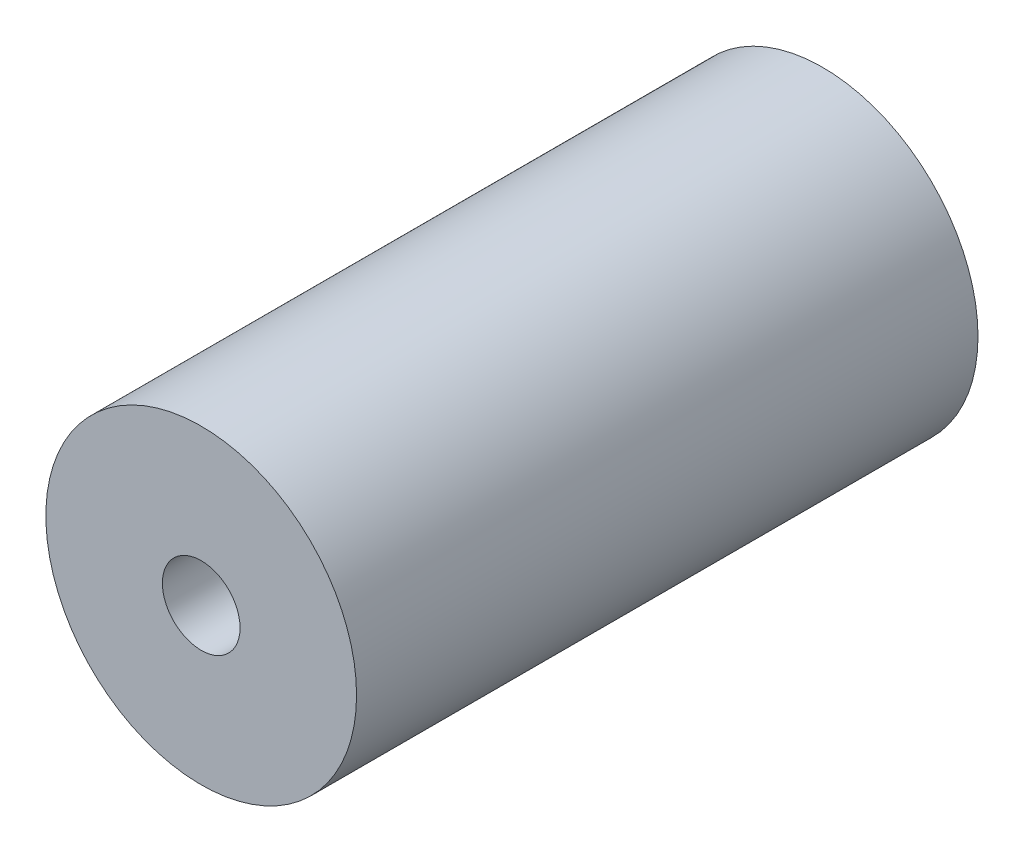
ISO-10303-21;
HEADER;
FILE_DESCRIPTION(('STEP AP214'),'2;1');
FILE_NAME('part.step','',(''),(''),'','','');
FILE_SCHEMA(('AUTOMOTIVE_DESIGN { 1 0 10303 214 1 1 1 1 }'));
ENDSEC;
DATA;
#1=APPLICATION_CONTEXT('core data for automotive mechanical design processes');
#2=APPLICATION_PROTOCOL_DEFINITION('international standard','automotive_design',2000,#1);
#3=PRODUCT_CONTEXT('',#1,'mechanical');
#4=PRODUCT('Part','Part','',(#3));
#5=PRODUCT_RELATED_PRODUCT_CATEGORY('part','',(#4));
#6=PRODUCT_DEFINITION_FORMATION('','',#4);
#7=PRODUCT_DEFINITION_CONTEXT('part definition',#1,'design');
#8=PRODUCT_DEFINITION('design','',#6,#7);
#9=PRODUCT_DEFINITION_SHAPE('','',#8);
#10=(LENGTH_UNIT() NAMED_UNIT(*) SI_UNIT(.MILLI.,.METRE.));
#11=(NAMED_UNIT(*) PLANE_ANGLE_UNIT() SI_UNIT($,.RADIAN.));
#12=(NAMED_UNIT(*) SI_UNIT($,.STERADIAN.) SOLID_ANGLE_UNIT());
#13=UNCERTAINTY_MEASURE_WITH_UNIT(LENGTH_MEASURE(1.E-05),#10,'distance_accuracy_value','');
#14=(GEOMETRIC_REPRESENTATION_CONTEXT(3) GLOBAL_UNCERTAINTY_ASSIGNED_CONTEXT((#13)) GLOBAL_UNIT_ASSIGNED_CONTEXT((#10,
#11,#12)) REPRESENTATION_CONTEXT('',''));
#15=CARTESIAN_POINT('',(0.,0.,0.));
#16=DIRECTION('',(0.,0.,1.));
#17=DIRECTION('',(1.,0.,0.));
#18=AXIS2_PLACEMENT_3D('',#15,#16,#17);
#19=CARTESIAN_POINT('',(0.,0.,10.));
#20=DIRECTION('',(0.,0.,1.));
#21=DIRECTION('',(1.,0.,0.));
#22=AXIS2_PLACEMENT_3D('',#19,#20,#21);
#23=PLANE('',#22);
#24=DIRECTION('',(0.999999969980788,-0.000245027392792052,0.));
#25=VECTOR('',#24,1.);
#26=CARTESIAN_POINT('',(-1.07243011245673,-0.899940916891799,10.));
#27=LINE('',#26,#25);
#28=CARTESIAN_POINT('',(-0.867476774897159,-0.899991136075253,10.));
#29=VERTEX_POINT('',#28);
#30=CARTESIAN_POINT('',(-0.831301535960417,-0.900000004416444,10.));
#31=VERTEX_POINT('',#30);
#32=EDGE_CURVE('E61',#29,#31,#27,.T.);
#33=ORIENTED_EDGE('',*,*,#32,.F.);
#34=CARTESIAN_POINT('',(0.,0.,10.));
#35=DIRECTION('',(0.,0.,1.));
#36=DIRECTION('',(1.,0.,0.));
#37=AXIS2_PLACEMENT_3D('',#34,#35,#36);
#38=CIRCLE('',#37,1.25);
#39=CARTESIAN_POINT('',(0.867467578644875,-0.899999999999999,10.));
#40=VERTEX_POINT('',#39);
#41=EDGE_CURVE('E88',#29,#40,#38,.T.);
#42=ORIENTED_EDGE('',*,*,#41,.T.);
#43=DIRECTION('',(1.,0.,0.));
#44=VECTOR('',#43,1.);
#45=CARTESIAN_POINT('',(0.831568398942515,-0.899999999999999,10.));
#46=LINE('',#45,#44);
#47=EDGE_CURVE('E94',#31,#40,#46,.T.);
#48=ORIENTED_EDGE('',*,*,#47,.F.);
#49=EDGE_LOOP('',(#33,#42,#48));
#50=FACE_BOUND('',#49,.T.);
#51=ADVANCED_FACE('F41',(#50),#23,.T.);
#52=CARTESIAN_POINT('',(0.,0.,0.));
#53=DIRECTION('',(0.,0.,1.));
#54=DIRECTION('',(1.,0.,0.));
#55=AXIS2_PLACEMENT_3D('',#52,#53,#54);
#56=PLANE('',#55);
#57=CARTESIAN_POINT('',(0.,0.,0.));
#58=DIRECTION('',(0.,0.,1.));
#59=DIRECTION('',(1.,0.,0.));
#60=AXIS2_PLACEMENT_3D('',#57,#58,#59);
#61=CIRCLE('',#60,5.00000000000001);
#62=CARTESIAN_POINT('',(5.,0.,0.));
#63=VERTEX_POINT('',#62);
#64=EDGE_CURVE('E11',#63,#63,#61,.T.);
#65=ORIENTED_EDGE('',*,*,#64,.F.);
#66=EDGE_LOOP('',(#65));
#67=FACE_BOUND('',#66,.T.);
#68=CARTESIAN_POINT('',(0.,0.,0.));
#69=DIRECTION('',(0.,0.,1.));
#70=DIRECTION('',(1.,0.,0.));
#71=AXIS2_PLACEMENT_3D('',#68,#69,#70);
#72=CIRCLE('',#71,1.4);
#73=CARTESIAN_POINT('',(1.07238053001312,-0.899999999360422,0.));
#74=VERTEX_POINT('',#73);
#75=CARTESIAN_POINT('',(-1.07243011245673,-0.899940916891799,0.));
#76=VERTEX_POINT('',#75);
#77=EDGE_CURVE('E108',#74,#76,#72,.T.);
#78=ORIENTED_EDGE('',*,*,#77,.T.);
#79=DIRECTION('',(0.999999969980788,-0.000245027392792052,0.));
#80=VECTOR('',#79,1.);
#81=CARTESIAN_POINT('',(-1.07243011245673,-0.899940916891799,0.));
#82=LINE('',#81,#80);
#83=CARTESIAN_POINT('',(-0.831301535960417,-0.899999999999999,0.));
#84=VERTEX_POINT('',#83);
#85=EDGE_CURVE('E107',#76,#84,#82,.T.);
#86=ORIENTED_EDGE('',*,*,#85,.T.);
#87=DIRECTION('',(1.,2.6559170364804E-09,0.));
#88=VECTOR('',#87,1.);
#89=CARTESIAN_POINT('',(0.831568398942515,-0.899999999999999,0.));
#90=LINE('',#89,#88);
#91=EDGE_CURVE('E111',#84,#74,#90,.T.);
#92=ORIENTED_EDGE('',*,*,#91,.T.);
#93=EDGE_LOOP('',(#78,#86,#92));
#94=FACE_BOUND('',#93,.T.);
#95=ADVANCED_FACE('F121',(#67,#94),#56,.F.);
#96=CARTESIAN_POINT('',(0.,0.,10.));
#97=DIRECTION('',(0.,0.,-1.));
#98=DIRECTION('',(-1.,0.,0.));
#99=AXIS2_PLACEMENT_3D('',#96,#97,#98);
#100=CYLINDRICAL_SURFACE('',#99,5.00000000000001);
#101=ORIENTED_EDGE('',*,*,#64,.T.);
#102=EDGE_LOOP('',(#101));
#103=FACE_BOUND('',#102,.T.);
#104=CARTESIAN_POINT('',(0.,0.,20.));
#105=DIRECTION('',(0.,0.,1.));
#106=DIRECTION('',(1.,0.,0.));
#107=AXIS2_PLACEMENT_3D('',#104,#105,#106);
#108=CIRCLE('',#107,5.);
#109=CARTESIAN_POINT('',(5.,0.,20.));
#110=VERTEX_POINT('',#109);
#111=EDGE_CURVE('E109',#110,#110,#108,.T.);
#112=ORIENTED_EDGE('',*,*,#111,.F.);
#113=EDGE_LOOP('',(#112));
#114=FACE_BOUND('',#113,.T.);
#115=ADVANCED_FACE('F43',(#103,#114),#100,.T.);
#116=CARTESIAN_POINT('',(0.,0.,10.));
#117=DIRECTION('',(0.,0.,-1.));
#118=DIRECTION('',(-1.,0.,0.));
#119=AXIS2_PLACEMENT_3D('',#116,#117,#118);
#120=CYLINDRICAL_SURFACE('',#119,1.4);
#121=ORIENTED_EDGE('',*,*,#77,.F.);
#122=DIRECTION('',(0.,0.,-1.));
#123=VECTOR('',#122,1.);
#124=CARTESIAN_POINT('',(1.07238053001312,-0.899999999360422,10.));
#125=LINE('',#124,#123);
#126=CARTESIAN_POINT('',(1.07238053001312,-0.899999999360422,10.));
#127=VERTEX_POINT('',#126);
#128=EDGE_CURVE('E103',#127,#74,#125,.T.);
#129=ORIENTED_EDGE('',*,*,#128,.F.);
#130=CARTESIAN_POINT('',(0.,0.,10.));
#131=DIRECTION('',(0.,0.,1.));
#132=DIRECTION('',(1.,0.,0.));
#133=AXIS2_PLACEMENT_3D('',#130,#131,#132);
#134=CIRCLE('',#133,1.4);
#135=CARTESIAN_POINT('',(-1.07243011245673,-0.899940916891799,10.));
#136=VERTEX_POINT('',#135);
#137=EDGE_CURVE('E96',#127,#136,#134,.T.);
#138=ORIENTED_EDGE('',*,*,#137,.T.);
#139=DIRECTION('',(0.,0.,-1.));
#140=VECTOR('',#139,1.);
#141=CARTESIAN_POINT('',(-1.07243011245673,-0.899940916891799,10.));
#142=LINE('',#141,#140);
#143=EDGE_CURVE('E47',#136,#76,#142,.T.);
#144=ORIENTED_EDGE('',*,*,#143,.T.);
#145=EDGE_LOOP('',(#121,#129,#138,#144));
#146=FACE_BOUND('',#145,.T.);
#147=ADVANCED_FACE('F119',(#146),#120,.F.);
#148=CARTESIAN_POINT('',(-1.07243011245673,-0.899940916891799,10.));
#149=DIRECTION('',(0.000245027392792052,0.999999969980788,0.));
#150=DIRECTION('',(-0.999999969980788,0.000245027392792052,0.));
#151=AXIS2_PLACEMENT_3D('',#148,#149,#150);
#152=PLANE('',#151);
#153=ORIENTED_EDGE('',*,*,#85,.F.);
#154=ORIENTED_EDGE('',*,*,#143,.F.);
#155=EDGE_CURVE('E81',#136,#29,#27,.T.);
#156=ORIENTED_EDGE('',*,*,#155,.T.);
#157=ORIENTED_EDGE('',*,*,#32,.T.);
#158=DIRECTION('',(0.,0.,-1.));
#159=VECTOR('',#158,1.);
#160=CARTESIAN_POINT('',(-0.831301535960417,-0.899999999999999,10.));
#161=LINE('',#160,#159);
#162=EDGE_CURVE('E120',#31,#84,#161,.T.);
#163=ORIENTED_EDGE('',*,*,#162,.T.);
#164=EDGE_LOOP('',(#153,#154,#156,#157,#163));
#165=FACE_BOUND('',#164,.T.);
#166=ADVANCED_FACE('F99',(#165),#152,.T.);
#167=CARTESIAN_POINT('',(0.831568398942515,-0.899999999999999,10.));
#168=DIRECTION('',(-2.6559170364804E-09,1.,0.));
#169=DIRECTION('',(-1.,-2.6559170364804E-09,0.));
#170=AXIS2_PLACEMENT_3D('',#167,#168,#169);
#171=PLANE('',#170);
#172=ORIENTED_EDGE('',*,*,#91,.F.);
#173=ORIENTED_EDGE('',*,*,#162,.F.);
#174=ORIENTED_EDGE('',*,*,#47,.T.);
#175=EDGE_CURVE('E86',#40,#127,#46,.T.);
#176=ORIENTED_EDGE('',*,*,#175,.T.);
#177=ORIENTED_EDGE('',*,*,#128,.T.);
#178=EDGE_LOOP('',(#172,#173,#174,#176,#177));
#179=FACE_BOUND('',#178,.T.);
#180=ADVANCED_FACE('F124',(#179),#171,.T.);
#181=CARTESIAN_POINT('',(0.,0.,20.));
#182=DIRECTION('',(0.,0.,1.));
#183=DIRECTION('',(1.,0.,0.));
#184=AXIS2_PLACEMENT_3D('',#181,#182,#183);
#185=PLANE('',#184);
#186=ORIENTED_EDGE('',*,*,#111,.T.);
#187=EDGE_LOOP('',(#186));
#188=FACE_BOUND('',#187,.T.);
#189=CARTESIAN_POINT('',(0.,0.,20.));
#190=DIRECTION('',(0.,0.,1.));
#191=DIRECTION('',(1.,0.,0.));
#192=AXIS2_PLACEMENT_3D('',#189,#190,#191);
#193=CIRCLE('',#192,1.25);
#194=CARTESIAN_POINT('',(1.25,0.,20.));
#195=VERTEX_POINT('',#194);
#196=EDGE_CURVE('E92',#195,#195,#193,.T.);
#197=ORIENTED_EDGE('',*,*,#196,.F.);
#198=EDGE_LOOP('',(#197));
#199=FACE_BOUND('',#198,.T.);
#200=ADVANCED_FACE('F130',(#188,#199),#185,.T.);
#201=CARTESIAN_POINT('',(0.,0.,10.));
#202=DIRECTION('',(0.,0.,1.));
#203=DIRECTION('',(1.,0.,0.));
#204=AXIS2_PLACEMENT_3D('',#201,#202,#203);
#205=PLANE('',#204);
#206=ORIENTED_EDGE('',*,*,#155,.F.);
#207=ORIENTED_EDGE('',*,*,#137,.F.);
#208=ORIENTED_EDGE('',*,*,#175,.F.);
#209=EDGE_CURVE('E54',#40,#29,#38,.T.);
#210=ORIENTED_EDGE('',*,*,#209,.T.);
#211=EDGE_LOOP('',(#206,#207,#208,#210));
#212=FACE_BOUND('',#211,.T.);
#213=ADVANCED_FACE('F85',(#212),#205,.F.);
#214=CARTESIAN_POINT('',(0.,0.,20.));
#215=DIRECTION('',(0.,0.,-1.));
#216=DIRECTION('',(-1.,0.,0.));
#217=AXIS2_PLACEMENT_3D('',#214,#215,#216);
#218=CYLINDRICAL_SURFACE('',#217,1.25);
#219=ORIENTED_EDGE('',*,*,#196,.T.);
#220=EDGE_LOOP('',(#219));
#221=FACE_BOUND('',#220,.T.);
#222=ORIENTED_EDGE('',*,*,#41,.F.);
#223=ORIENTED_EDGE('',*,*,#209,.F.);
#224=EDGE_LOOP('',(#222,#223));
#225=FACE_BOUND('',#224,.T.);
#226=ADVANCED_FACE('F89',(#221,#225),#218,.F.);
#227=CLOSED_SHELL('',(#51,#95,#115,#147,#166,#180,#200,#213,#226));
#228=MANIFOLD_SOLID_BREP('B2',#227);
#229=ADVANCED_BREP_SHAPE_REPRESENTATION('',(#18,#228),#14);
#230=SHAPE_DEFINITION_REPRESENTATION(#9,#229);
ENDSEC;
END-ISO-10303-21;
